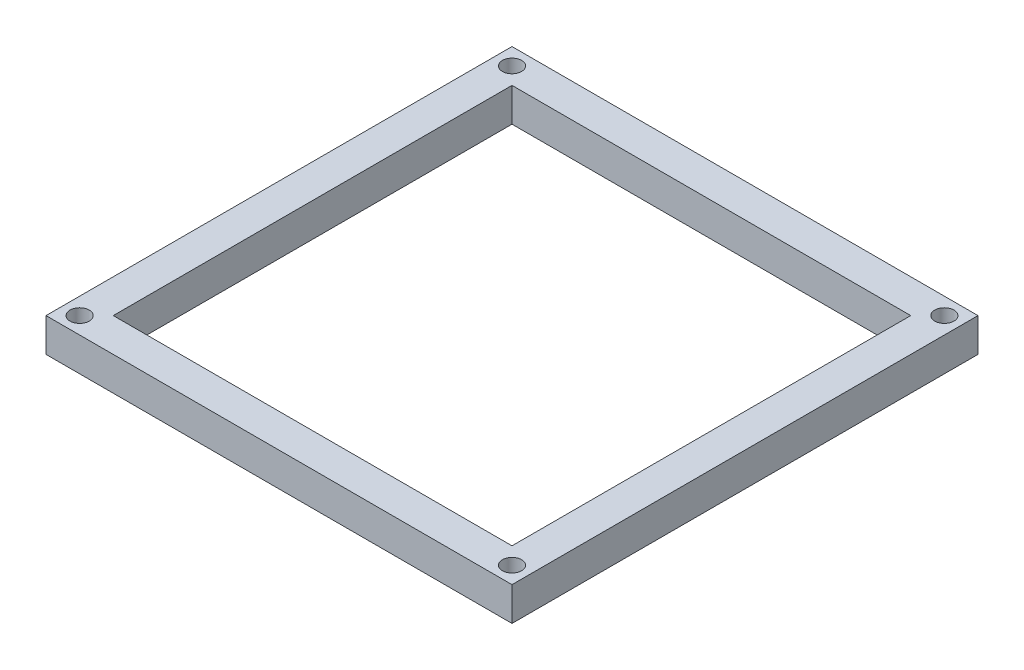
ISO-10303-21;
HEADER;
FILE_DESCRIPTION(('STEP AP214'),'2;1');
FILE_NAME('part.step','',(''),(''),'','','');
FILE_SCHEMA(('AUTOMOTIVE_DESIGN { 1 0 10303 214 1 1 1 1 }'));
ENDSEC;
DATA;
#1=APPLICATION_CONTEXT('core data for automotive mechanical design processes');
#2=APPLICATION_PROTOCOL_DEFINITION('international standard','automotive_design',2000,#1);
#3=PRODUCT_CONTEXT('',#1,'mechanical');
#4=PRODUCT('Part','Part','',(#3));
#5=PRODUCT_RELATED_PRODUCT_CATEGORY('part','',(#4));
#6=PRODUCT_DEFINITION_FORMATION('','',#4);
#7=PRODUCT_DEFINITION_CONTEXT('part definition',#1,'design');
#8=PRODUCT_DEFINITION('design','',#6,#7);
#9=PRODUCT_DEFINITION_SHAPE('','',#8);
#10=(LENGTH_UNIT() NAMED_UNIT(*) SI_UNIT(.MILLI.,.METRE.));
#11=(NAMED_UNIT(*) PLANE_ANGLE_UNIT() SI_UNIT($,.RADIAN.));
#12=(NAMED_UNIT(*) SI_UNIT($,.STERADIAN.) SOLID_ANGLE_UNIT());
#13=UNCERTAINTY_MEASURE_WITH_UNIT(LENGTH_MEASURE(1.E-05),#10,'distance_accuracy_value','');
#14=(GEOMETRIC_REPRESENTATION_CONTEXT(3) GLOBAL_UNCERTAINTY_ASSIGNED_CONTEXT((#13)) GLOBAL_UNIT_ASSIGNED_CONTEXT((#10,
#11,#12)) REPRESENTATION_CONTEXT('',''));
#15=CARTESIAN_POINT('',(0.,0.,0.));
#16=DIRECTION('',(0.,0.,1.));
#17=DIRECTION('',(1.,0.,0.));
#18=AXIS2_PLACEMENT_3D('',#15,#16,#17);
#19=CARTESIAN_POINT('',(0.,7.,0.));
#20=DIRECTION('',(1.,0.,0.));
#21=DIRECTION('',(0.,0.,-1.));
#22=AXIS2_PLACEMENT_3D('',#19,#20,#21);
#23=PLANE('',#22);
#24=DIRECTION('',(0.,0.,1.));
#25=VECTOR('',#24,1.);
#26=CARTESIAN_POINT('',(0.,0.,0.));
#27=LINE('',#26,#25);
#28=CARTESIAN_POINT('',(0.,0.,-97.));
#29=VERTEX_POINT('',#28);
#30=CARTESIAN_POINT('',(0.,0.,0.));
#31=VERTEX_POINT('',#30);
#32=EDGE_CURVE('E136',#29,#31,#27,.T.);
#33=ORIENTED_EDGE('',*,*,#32,.T.);
#34=DIRECTION('',(0.,-1.,0.));
#35=VECTOR('',#34,1.);
#36=CARTESIAN_POINT('',(0.,7.,0.));
#37=LINE('',#36,#35);
#38=CARTESIAN_POINT('',(0.,7.,0.));
#39=VERTEX_POINT('',#38);
#40=EDGE_CURVE('E11',#39,#31,#37,.T.);
#41=ORIENTED_EDGE('',*,*,#40,.F.);
#42=DIRECTION('',(0.,0.,1.));
#43=VECTOR('',#42,1.);
#44=CARTESIAN_POINT('',(0.,7.,0.));
#45=LINE('',#44,#43);
#46=CARTESIAN_POINT('',(0.,7.,-97.));
#47=VERTEX_POINT('',#46);
#48=EDGE_CURVE('E140',#47,#39,#45,.T.);
#49=ORIENTED_EDGE('',*,*,#48,.F.);
#50=DIRECTION('',(0.,-1.,0.));
#51=VECTOR('',#50,1.);
#52=CARTESIAN_POINT('',(0.,7.,-97.));
#53=LINE('',#52,#51);
#54=EDGE_CURVE('E150',#47,#29,#53,.T.);
#55=ORIENTED_EDGE('',*,*,#54,.T.);
#56=EDGE_LOOP('',(#33,#41,#49,#55));
#57=FACE_BOUND('',#56,.T.);
#58=ADVANCED_FACE('F34',(#57),#23,.F.);
#59=CARTESIAN_POINT('',(0.,7.,0.));
#60=DIRECTION('',(0.,0.,-1.));
#61=DIRECTION('',(-1.,0.,0.));
#62=AXIS2_PLACEMENT_3D('',#59,#60,#61);
#63=PLANE('',#62);
#64=DIRECTION('',(1.,0.,0.));
#65=VECTOR('',#64,1.);
#66=CARTESIAN_POINT('',(0.,0.,0.));
#67=LINE('',#66,#65);
#68=CARTESIAN_POINT('',(97.,0.,0.));
#69=VERTEX_POINT('',#68);
#70=EDGE_CURVE('E153',#31,#69,#67,.T.);
#71=ORIENTED_EDGE('',*,*,#70,.T.);
#72=DIRECTION('',(0.,-1.,0.));
#73=VECTOR('',#72,1.);
#74=CARTESIAN_POINT('',(97.,7.,0.));
#75=LINE('',#74,#73);
#76=CARTESIAN_POINT('',(97.,7.,0.));
#77=VERTEX_POINT('',#76);
#78=EDGE_CURVE('E42',#77,#69,#75,.T.);
#79=ORIENTED_EDGE('',*,*,#78,.F.);
#80=DIRECTION('',(1.,0.,0.));
#81=VECTOR('',#80,1.);
#82=CARTESIAN_POINT('',(0.,7.,0.));
#83=LINE('',#82,#81);
#84=EDGE_CURVE('E143',#39,#77,#83,.T.);
#85=ORIENTED_EDGE('',*,*,#84,.F.);
#86=ORIENTED_EDGE('',*,*,#40,.T.);
#87=EDGE_LOOP('',(#71,#79,#85,#86));
#88=FACE_BOUND('',#87,.T.);
#89=ADVANCED_FACE('F224',(#88),#63,.F.);
#90=CARTESIAN_POINT('',(97.,7.,0.));
#91=DIRECTION('',(-1.,0.,0.));
#92=DIRECTION('',(0.,0.,1.));
#93=AXIS2_PLACEMENT_3D('',#90,#91,#92);
#94=PLANE('',#93);
#95=DIRECTION('',(0.,0.,-1.));
#96=VECTOR('',#95,1.);
#97=CARTESIAN_POINT('',(97.,0.,0.));
#98=LINE('',#97,#96);
#99=CARTESIAN_POINT('',(97.,0.,-97.));
#100=VERTEX_POINT('',#99);
#101=EDGE_CURVE('E155',#69,#100,#98,.T.);
#102=ORIENTED_EDGE('',*,*,#101,.T.);
#103=DIRECTION('',(0.,-1.,0.));
#104=VECTOR('',#103,1.);
#105=CARTESIAN_POINT('',(97.,7.,-97.));
#106=LINE('',#105,#104);
#107=CARTESIAN_POINT('',(97.,7.,-97.));
#108=VERTEX_POINT('',#107);
#109=EDGE_CURVE('E160',#108,#100,#106,.T.);
#110=ORIENTED_EDGE('',*,*,#109,.F.);
#111=DIRECTION('',(0.,0.,-1.));
#112=VECTOR('',#111,1.);
#113=CARTESIAN_POINT('',(97.,7.,0.));
#114=LINE('',#113,#112);
#115=EDGE_CURVE('E146',#77,#108,#114,.T.);
#116=ORIENTED_EDGE('',*,*,#115,.F.);
#117=ORIENTED_EDGE('',*,*,#78,.T.);
#118=EDGE_LOOP('',(#102,#110,#116,#117));
#119=FACE_BOUND('',#118,.T.);
#120=ADVANCED_FACE('F229',(#119),#94,.F.);
#121=CARTESIAN_POINT('',(0.,7.,-97.));
#122=DIRECTION('',(0.,0.,1.));
#123=DIRECTION('',(1.,0.,0.));
#124=AXIS2_PLACEMENT_3D('',#121,#122,#123);
#125=PLANE('',#124);
#126=DIRECTION('',(-1.,0.,0.));
#127=VECTOR('',#126,1.);
#128=CARTESIAN_POINT('',(0.,0.,-97.));
#129=LINE('',#128,#127);
#130=EDGE_CURVE('E144',#100,#29,#129,.T.);
#131=ORIENTED_EDGE('',*,*,#130,.T.);
#132=ORIENTED_EDGE('',*,*,#54,.F.);
#133=DIRECTION('',(-1.,0.,0.));
#134=VECTOR('',#133,1.);
#135=CARTESIAN_POINT('',(0.,7.,-97.));
#136=LINE('',#135,#134);
#137=EDGE_CURVE('E148',#108,#47,#136,.T.);
#138=ORIENTED_EDGE('',*,*,#137,.F.);
#139=ORIENTED_EDGE('',*,*,#109,.T.);
#140=EDGE_LOOP('',(#131,#132,#138,#139));
#141=FACE_BOUND('',#140,.T.);
#142=ADVANCED_FACE('F210',(#141),#125,.F.);
#143=CARTESIAN_POINT('',(0.,7.,0.));
#144=DIRECTION('',(0.,-1.,0.));
#145=DIRECTION('',(0.,0.,-1.));
#146=AXIS2_PLACEMENT_3D('',#143,#144,#145);
#147=PLANE('',#146);
#148=CARTESIAN_POINT('',(93.5,7.,-93.5));
#149=DIRECTION('',(0.,1.,0.));
#150=DIRECTION('',(0.,0.,1.));
#151=AXIS2_PLACEMENT_3D('',#148,#149,#150);
#152=CIRCLE('',#151,2.);
#153=CARTESIAN_POINT('',(93.5,7.,-91.5));
#154=VERTEX_POINT('',#153);
#155=EDGE_CURVE('E197',#154,#154,#152,.T.);
#156=ORIENTED_EDGE('',*,*,#155,.F.);
#157=EDGE_LOOP('',(#156));
#158=FACE_BOUND('',#157,.T.);
#159=CARTESIAN_POINT('',(3.5,7.,-3.5));
#160=DIRECTION('',(0.,1.,0.));
#161=DIRECTION('',(0.,0.,1.));
#162=AXIS2_PLACEMENT_3D('',#159,#160,#161);
#163=CIRCLE('',#162,2.);
#164=CARTESIAN_POINT('',(3.5,7.,-1.49999999999999));
#165=VERTEX_POINT('',#164);
#166=EDGE_CURVE('E199',#165,#165,#163,.T.);
#167=ORIENTED_EDGE('',*,*,#166,.F.);
#168=EDGE_LOOP('',(#167));
#169=FACE_BOUND('',#168,.T.);
#170=CARTESIAN_POINT('',(93.5,7.,-3.5));
#171=DIRECTION('',(0.,1.,0.));
#172=DIRECTION('',(0.,0.,1.));
#173=AXIS2_PLACEMENT_3D('',#170,#171,#172);
#174=CIRCLE('',#173,2.);
#175=CARTESIAN_POINT('',(93.5,7.,-1.5));
#176=VERTEX_POINT('',#175);
#177=EDGE_CURVE('E203',#176,#176,#174,.T.);
#178=ORIENTED_EDGE('',*,*,#177,.F.);
#179=EDGE_LOOP('',(#178));
#180=FACE_BOUND('',#179,.T.);
#181=CARTESIAN_POINT('',(3.5,7.,-93.5));
#182=DIRECTION('',(0.,1.,0.));
#183=DIRECTION('',(0.,0.,1.));
#184=AXIS2_PLACEMENT_3D('',#181,#182,#183);
#185=CIRCLE('',#184,2.);
#186=CARTESIAN_POINT('',(3.5,7.,-91.5));
#187=VERTEX_POINT('',#186);
#188=EDGE_CURVE('E124',#187,#187,#185,.T.);
#189=ORIENTED_EDGE('',*,*,#188,.F.);
#190=EDGE_LOOP('',(#189));
#191=FACE_BOUND('',#190,.T.);
#192=DIRECTION('',(-1.,0.,0.));
#193=VECTOR('',#192,1.);
#194=CARTESIAN_POINT('',(7.00000000000001,7.,-90.));
#195=LINE('',#194,#193);
#196=CARTESIAN_POINT('',(90.,7.,-90.));
#197=VERTEX_POINT('',#196);
#198=CARTESIAN_POINT('',(7.00000000000001,7.,-90.));
#199=VERTEX_POINT('',#198);
#200=EDGE_CURVE('E130',#197,#199,#195,.T.);
#201=ORIENTED_EDGE('',*,*,#200,.F.);
#202=DIRECTION('',(0.,0.,-1.));
#203=VECTOR('',#202,1.);
#204=CARTESIAN_POINT('',(90.,7.,-6.99999999999999));
#205=LINE('',#204,#203);
#206=CARTESIAN_POINT('',(90.,7.,-6.99999999999999));
#207=VERTEX_POINT('',#206);
#208=EDGE_CURVE('E50',#207,#197,#205,.T.);
#209=ORIENTED_EDGE('',*,*,#208,.F.);
#210=DIRECTION('',(1.,0.,0.));
#211=VECTOR('',#210,1.);
#212=CARTESIAN_POINT('',(7.00000000000001,7.,-6.99999999999999));
#213=LINE('',#212,#211);
#214=CARTESIAN_POINT('',(7.00000000000001,7.,-6.99999999999999));
#215=VERTEX_POINT('',#214);
#216=EDGE_CURVE('E118',#215,#207,#213,.T.);
#217=ORIENTED_EDGE('',*,*,#216,.F.);
#218=DIRECTION('',(0.,0.,1.));
#219=VECTOR('',#218,1.);
#220=CARTESIAN_POINT('',(7.00000000000001,7.,-6.99999999999999));
#221=LINE('',#220,#219);
#222=EDGE_CURVE('E121',#199,#215,#221,.T.);
#223=ORIENTED_EDGE('',*,*,#222,.F.);
#224=EDGE_LOOP('',(#201,#209,#217,#223));
#225=FACE_BOUND('',#224,.T.);
#226=ORIENTED_EDGE('',*,*,#48,.T.);
#227=ORIENTED_EDGE('',*,*,#84,.T.);
#228=ORIENTED_EDGE('',*,*,#115,.T.);
#229=ORIENTED_EDGE('',*,*,#137,.T.);
#230=EDGE_LOOP('',(#226,#227,#228,#229));
#231=FACE_BOUND('',#230,.T.);
#232=ADVANCED_FACE('F182',(#158,#169,#180,#191,#225,#231),#147,.F.);
#233=CARTESIAN_POINT('',(0.,0.,0.));
#234=DIRECTION('',(0.,-1.,0.));
#235=DIRECTION('',(0.,0.,-1.));
#236=AXIS2_PLACEMENT_3D('',#233,#234,#235);
#237=PLANE('',#236);
#238=CARTESIAN_POINT('',(93.5,0.,-93.5));
#239=DIRECTION('',(0.,-1.,0.));
#240=DIRECTION('',(0.,0.,-1.));
#241=AXIS2_PLACEMENT_3D('',#238,#239,#240);
#242=CIRCLE('',#241,2.);
#243=CARTESIAN_POINT('',(93.5,0.,-95.5));
#244=VERTEX_POINT('',#243);
#245=EDGE_CURVE('E37',#244,#244,#242,.T.);
#246=ORIENTED_EDGE('',*,*,#245,.F.);
#247=EDGE_LOOP('',(#246));
#248=FACE_BOUND('',#247,.T.);
#249=CARTESIAN_POINT('',(3.5,0.,-3.5));
#250=DIRECTION('',(0.,-1.,0.));
#251=DIRECTION('',(0.,0.,-1.));
#252=AXIS2_PLACEMENT_3D('',#249,#250,#251);
#253=CIRCLE('',#252,2.);
#254=CARTESIAN_POINT('',(3.5,0.,-5.5));
#255=VERTEX_POINT('',#254);
#256=EDGE_CURVE('E170',#255,#255,#253,.T.);
#257=ORIENTED_EDGE('',*,*,#256,.F.);
#258=EDGE_LOOP('',(#257));
#259=FACE_BOUND('',#258,.T.);
#260=CARTESIAN_POINT('',(93.5,0.,-3.5));
#261=DIRECTION('',(0.,-1.,0.));
#262=DIRECTION('',(0.,0.,-1.));
#263=AXIS2_PLACEMENT_3D('',#260,#261,#262);
#264=CIRCLE('',#263,2.);
#265=CARTESIAN_POINT('',(93.5,0.,-5.49999999999999));
#266=VERTEX_POINT('',#265);
#267=EDGE_CURVE('E168',#266,#266,#264,.T.);
#268=ORIENTED_EDGE('',*,*,#267,.F.);
#269=EDGE_LOOP('',(#268));
#270=FACE_BOUND('',#269,.T.);
#271=CARTESIAN_POINT('',(3.5,0.,-93.5));
#272=DIRECTION('',(0.,-1.,0.));
#273=DIRECTION('',(0.,0.,-1.));
#274=AXIS2_PLACEMENT_3D('',#271,#272,#273);
#275=CIRCLE('',#274,2.);
#276=CARTESIAN_POINT('',(3.5,0.,-95.5));
#277=VERTEX_POINT('',#276);
#278=EDGE_CURVE('E165',#277,#277,#275,.T.);
#279=ORIENTED_EDGE('',*,*,#278,.F.);
#280=EDGE_LOOP('',(#279));
#281=FACE_BOUND('',#280,.T.);
#282=DIRECTION('',(0.,0.,-1.));
#283=VECTOR('',#282,1.);
#284=CARTESIAN_POINT('',(90.,0.,-6.99999999999999));
#285=LINE('',#284,#283);
#286=CARTESIAN_POINT('',(90.,0.,-6.99999999999999));
#287=VERTEX_POINT('',#286);
#288=CARTESIAN_POINT('',(90.,0.,-90.));
#289=VERTEX_POINT('',#288);
#290=EDGE_CURVE('E102',#287,#289,#285,.T.);
#291=ORIENTED_EDGE('',*,*,#290,.T.);
#292=DIRECTION('',(-1.,0.,0.));
#293=VECTOR('',#292,1.);
#294=CARTESIAN_POINT('',(7.00000000000001,0.,-90.));
#295=LINE('',#294,#293);
#296=CARTESIAN_POINT('',(7.00000000000001,0.,-90.));
#297=VERTEX_POINT('',#296);
#298=EDGE_CURVE('E111',#289,#297,#295,.T.);
#299=ORIENTED_EDGE('',*,*,#298,.T.);
#300=DIRECTION('',(0.,0.,1.));
#301=VECTOR('',#300,1.);
#302=CARTESIAN_POINT('',(7.00000000000001,0.,-6.99999999999999));
#303=LINE('',#302,#301);
#304=CARTESIAN_POINT('',(7.00000000000001,0.,-6.99999999999999));
#305=VERTEX_POINT('',#304);
#306=EDGE_CURVE('E58',#297,#305,#303,.T.);
#307=ORIENTED_EDGE('',*,*,#306,.T.);
#308=DIRECTION('',(1.,0.,0.));
#309=VECTOR('',#308,1.);
#310=CARTESIAN_POINT('',(7.00000000000001,0.,-6.99999999999999));
#311=LINE('',#310,#309);
#312=EDGE_CURVE('E108',#305,#287,#311,.T.);
#313=ORIENTED_EDGE('',*,*,#312,.T.);
#314=EDGE_LOOP('',(#291,#299,#307,#313));
#315=FACE_BOUND('',#314,.T.);
#316=ORIENTED_EDGE('',*,*,#32,.F.);
#317=ORIENTED_EDGE('',*,*,#130,.F.);
#318=ORIENTED_EDGE('',*,*,#101,.F.);
#319=ORIENTED_EDGE('',*,*,#70,.F.);
#320=EDGE_LOOP('',(#316,#317,#318,#319));
#321=FACE_BOUND('',#320,.T.);
#322=ADVANCED_FACE('F115',(#248,#259,#270,#281,#315,#321),#237,.T.);
#323=CARTESIAN_POINT('',(90.,0.,-6.99999999999999));
#324=DIRECTION('',(1.,0.,0.));
#325=DIRECTION('',(0.,0.,-1.));
#326=AXIS2_PLACEMENT_3D('',#323,#324,#325);
#327=PLANE('',#326);
#328=ORIENTED_EDGE('',*,*,#208,.T.);
#329=DIRECTION('',(0.,1.,0.));
#330=VECTOR('',#329,1.);
#331=CARTESIAN_POINT('',(90.,0.,-90.));
#332=LINE('',#331,#330);
#333=EDGE_CURVE('E98',#289,#197,#332,.T.);
#334=ORIENTED_EDGE('',*,*,#333,.F.);
#335=ORIENTED_EDGE('',*,*,#290,.F.);
#336=DIRECTION('',(0.,1.,0.));
#337=VECTOR('',#336,1.);
#338=CARTESIAN_POINT('',(90.,0.,-6.99999999999999));
#339=LINE('',#338,#337);
#340=EDGE_CURVE('E134',#287,#207,#339,.T.);
#341=ORIENTED_EDGE('',*,*,#340,.T.);
#342=EDGE_LOOP('',(#328,#334,#335,#341));
#343=FACE_BOUND('',#342,.T.);
#344=ADVANCED_FACE('F100',(#343),#327,.F.);
#345=CARTESIAN_POINT('',(7.00000000000001,0.,-6.99999999999999));
#346=DIRECTION('',(0.,0.,1.));
#347=DIRECTION('',(1.,0.,0.));
#348=AXIS2_PLACEMENT_3D('',#345,#346,#347);
#349=PLANE('',#348);
#350=ORIENTED_EDGE('',*,*,#216,.T.);
#351=ORIENTED_EDGE('',*,*,#340,.F.);
#352=ORIENTED_EDGE('',*,*,#312,.F.);
#353=DIRECTION('',(0.,1.,0.));
#354=VECTOR('',#353,1.);
#355=CARTESIAN_POINT('',(7.00000000000001,0.,-6.99999999999999));
#356=LINE('',#355,#354);
#357=EDGE_CURVE('E137',#305,#215,#356,.T.);
#358=ORIENTED_EDGE('',*,*,#357,.T.);
#359=EDGE_LOOP('',(#350,#351,#352,#358));
#360=FACE_BOUND('',#359,.T.);
#361=ADVANCED_FACE('F262',(#360),#349,.F.);
#362=CARTESIAN_POINT('',(7.00000000000001,0.,-6.99999999999999));
#363=DIRECTION('',(-1.,0.,0.));
#364=DIRECTION('',(0.,0.,1.));
#365=AXIS2_PLACEMENT_3D('',#362,#363,#364);
#366=PLANE('',#365);
#367=ORIENTED_EDGE('',*,*,#222,.T.);
#368=ORIENTED_EDGE('',*,*,#357,.F.);
#369=ORIENTED_EDGE('',*,*,#306,.F.);
#370=DIRECTION('',(0.,1.,0.));
#371=VECTOR('',#370,1.);
#372=CARTESIAN_POINT('',(7.00000000000001,0.,-90.));
#373=LINE('',#372,#371);
#374=EDGE_CURVE('E107',#297,#199,#373,.T.);
#375=ORIENTED_EDGE('',*,*,#374,.T.);
#376=EDGE_LOOP('',(#367,#368,#369,#375));
#377=FACE_BOUND('',#376,.T.);
#378=ADVANCED_FACE('F272',(#377),#366,.F.);
#379=CARTESIAN_POINT('',(7.00000000000001,0.,-90.));
#380=DIRECTION('',(0.,0.,-1.));
#381=DIRECTION('',(-1.,0.,0.));
#382=AXIS2_PLACEMENT_3D('',#379,#380,#381);
#383=PLANE('',#382);
#384=ORIENTED_EDGE('',*,*,#200,.T.);
#385=ORIENTED_EDGE('',*,*,#374,.F.);
#386=ORIENTED_EDGE('',*,*,#298,.F.);
#387=ORIENTED_EDGE('',*,*,#333,.T.);
#388=EDGE_LOOP('',(#384,#385,#386,#387));
#389=FACE_BOUND('',#388,.T.);
#390=ADVANCED_FACE('F112',(#389),#383,.F.);
#391=CARTESIAN_POINT('',(3.5,-3.,-93.5));
#392=DIRECTION('',(0.,1.,0.));
#393=DIRECTION('',(0.,0.,1.));
#394=AXIS2_PLACEMENT_3D('',#391,#392,#393);
#395=CYLINDRICAL_SURFACE('',#394,2.);
#396=ORIENTED_EDGE('',*,*,#278,.T.);
#397=EDGE_LOOP('',(#396));
#398=FACE_BOUND('',#397,.T.);
#399=ORIENTED_EDGE('',*,*,#188,.T.);
#400=EDGE_LOOP('',(#399));
#401=FACE_BOUND('',#400,.T.);
#402=ADVANCED_FACE('F189',(#398,#401),#395,.F.);
#403=CARTESIAN_POINT('',(93.5,-3.,-3.5));
#404=DIRECTION('',(0.,1.,0.));
#405=DIRECTION('',(0.,0.,1.));
#406=AXIS2_PLACEMENT_3D('',#403,#404,#405);
#407=CYLINDRICAL_SURFACE('',#406,2.);
#408=ORIENTED_EDGE('',*,*,#267,.T.);
#409=EDGE_LOOP('',(#408));
#410=FACE_BOUND('',#409,.T.);
#411=ORIENTED_EDGE('',*,*,#177,.T.);
#412=EDGE_LOOP('',(#411));
#413=FACE_BOUND('',#412,.T.);
#414=ADVANCED_FACE('F192',(#410,#413),#407,.F.);
#415=CARTESIAN_POINT('',(3.5,-3.,-3.5));
#416=DIRECTION('',(0.,1.,0.));
#417=DIRECTION('',(0.,0.,1.));
#418=AXIS2_PLACEMENT_3D('',#415,#416,#417);
#419=CYLINDRICAL_SURFACE('',#418,2.);
#420=ORIENTED_EDGE('',*,*,#256,.T.);
#421=EDGE_LOOP('',(#420));
#422=FACE_BOUND('',#421,.T.);
#423=ORIENTED_EDGE('',*,*,#166,.T.);
#424=EDGE_LOOP('',(#423));
#425=FACE_BOUND('',#424,.T.);
#426=ADVANCED_FACE('F314',(#422,#425),#419,.F.);
#427=CARTESIAN_POINT('',(93.5,-3.,-93.5));
#428=DIRECTION('',(0.,1.,0.));
#429=DIRECTION('',(0.,0.,1.));
#430=AXIS2_PLACEMENT_3D('',#427,#428,#429);
#431=CYLINDRICAL_SURFACE('',#430,2.);
#432=ORIENTED_EDGE('',*,*,#245,.T.);
#433=EDGE_LOOP('',(#432));
#434=FACE_BOUND('',#433,.T.);
#435=ORIENTED_EDGE('',*,*,#155,.T.);
#436=EDGE_LOOP('',(#435));
#437=FACE_BOUND('',#436,.T.);
#438=ADVANCED_FACE('F177',(#434,#437),#431,.F.);
#439=CLOSED_SHELL('',(#58,#89,#120,#142,#232,#322,#344,#361,#378,#390,#402,#414,#426,#438));
#440=MANIFOLD_SOLID_BREP('B2',#439);
#441=ADVANCED_BREP_SHAPE_REPRESENTATION('',(#18,#440),#14);
#442=SHAPE_DEFINITION_REPRESENTATION(#9,#441);
ENDSEC;
END-ISO-10303-21;
